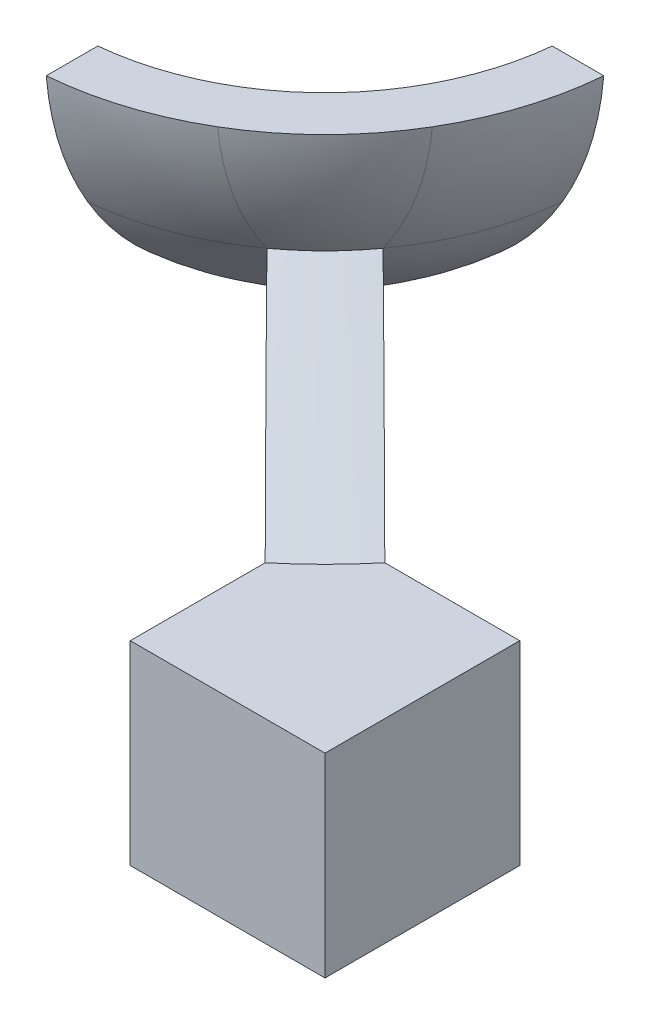
ISO-10303-21;
HEADER;
FILE_DESCRIPTION(('STEP AP214'),'2;1');
FILE_NAME('part.step','',(''),(''),'','','');
FILE_SCHEMA(('AUTOMOTIVE_DESIGN { 1 0 10303 214 1 1 1 1 }'));
ENDSEC;
DATA;
#1=APPLICATION_CONTEXT('core data for automotive mechanical design processes');
#2=APPLICATION_PROTOCOL_DEFINITION('international standard','automotive_design',2000,#1);
#3=PRODUCT_CONTEXT('',#1,'mechanical');
#4=PRODUCT('Part','Part','',(#3));
#5=PRODUCT_RELATED_PRODUCT_CATEGORY('part','',(#4));
#6=PRODUCT_DEFINITION_FORMATION('','',#4);
#7=PRODUCT_DEFINITION_CONTEXT('part definition',#1,'design');
#8=PRODUCT_DEFINITION('design','',#6,#7);
#9=PRODUCT_DEFINITION_SHAPE('','',#8);
#10=(LENGTH_UNIT() NAMED_UNIT(*) SI_UNIT(.MILLI.,.METRE.));
#11=(NAMED_UNIT(*) PLANE_ANGLE_UNIT() SI_UNIT($,.RADIAN.));
#12=(NAMED_UNIT(*) SI_UNIT($,.STERADIAN.) SOLID_ANGLE_UNIT());
#13=UNCERTAINTY_MEASURE_WITH_UNIT(LENGTH_MEASURE(1.E-05),#10,'distance_accuracy_value','');
#14=(GEOMETRIC_REPRESENTATION_CONTEXT(3) GLOBAL_UNCERTAINTY_ASSIGNED_CONTEXT((#13)) GLOBAL_UNIT_ASSIGNED_CONTEXT((#10,
#11,#12)) REPRESENTATION_CONTEXT('',''));
#15=CARTESIAN_POINT('',(0.,0.,0.));
#16=DIRECTION('',(0.,0.,1.));
#17=DIRECTION('',(1.,0.,0.));
#18=AXIS2_PLACEMENT_3D('',#15,#16,#17);
#19=CARTESIAN_POINT('',(20.4238486312594,0.,1.70874488464023));
#20=DIRECTION('',(0.,0.,1.));
#21=DIRECTION('',(-1.,0.,0.));
#22=AXIS2_PLACEMENT_3D('',#19,#20,#21);
#23=PLANE('',#22);
#24=CARTESIAN_POINT('',(0.,0.,1.7087448846402));
#25=DIRECTION('',(0.,0.,1.));
#26=DIRECTION('',(-1.,0.,0.));
#27=AXIS2_PLACEMENT_3D('',#24,#25,#26);
#28=CIRCLE('',#27,20.4238486312594);
#29=CARTESIAN_POINT('',(10.3965301491596,-17.5796972035986,1.70874488464014));
#30=VERTEX_POINT('',#29);
#31=CARTESIAN_POINT('',(17.5796972035986,-10.3965301491595,1.70874488464016));
#32=VERTEX_POINT('',#31);
#33=EDGE_CURVE('E216',#30,#32,#28,.T.);
#34=ORIENTED_EDGE('',*,*,#33,.F.);
#35=CARTESIAN_POINT('',(1.70874488464028,-20.352242722408,1.70874488464013));
#36=VERTEX_POINT('',#35);
#37=EDGE_CURVE('E221',#36,#30,#28,.T.);
#38=ORIENTED_EDGE('',*,*,#37,.F.);
#39=DIRECTION('',(0.,1.,0.));
#40=VECTOR('',#39,1.);
#41=CARTESIAN_POINT('',(1.70874488464021,0.,1.70874488464025));
#42=LINE('',#41,#40);
#43=CARTESIAN_POINT('',(1.70874488464027,-16.9058781989141,1.70874488464011));
#44=VERTEX_POINT('',#43);
#45=EDGE_CURVE('E175',#36,#44,#42,.T.);
#46=ORIENTED_EDGE('',*,*,#45,.T.);
#47=CARTESIAN_POINT('',(0.,0.,1.70874488464017));
#48=DIRECTION('',(0.,0.,1.));
#49=DIRECTION('',(-1.,0.,0.));
#50=AXIS2_PLACEMENT_3D('',#47,#48,#49);
#51=CIRCLE('',#50,16.9920136169114);
#52=CARTESIAN_POINT('',(9.85982311940891,-13.8388010611929,1.70874488464012));
#53=VERTEX_POINT('',#52);
#54=EDGE_CURVE('E214',#44,#53,#51,.T.);
#55=ORIENTED_EDGE('',*,*,#54,.T.);
#56=CARTESIAN_POINT('',(13.8388010611929,-9.85982311940887,1.70874488464019));
#57=VERTEX_POINT('',#56);
#58=EDGE_CURVE('E211',#53,#57,#51,.T.);
#59=ORIENTED_EDGE('',*,*,#58,.T.);
#60=CARTESIAN_POINT('',(0.,0.,1.70874488464021));
#61=DIRECTION('',(0.,0.,1.));
#62=DIRECTION('',(0.,-1.,0.));
#63=AXIS2_PLACEMENT_3D('',#60,#61,#62);
#64=CIRCLE('',#63,16.9920136169114);
#65=CARTESIAN_POINT('',(16.9058781989141,-1.70874488464017,1.70874488464017));
#66=VERTEX_POINT('',#65);
#67=EDGE_CURVE('E225',#57,#66,#64,.T.);
#68=ORIENTED_EDGE('',*,*,#67,.T.);
#69=DIRECTION('',(-1.,0.,0.));
#70=VECTOR('',#69,1.);
#71=CARTESIAN_POINT('',(20.4238486312594,-1.70874488464022,1.70874488464022));
#72=LINE('',#71,#70);
#73=CARTESIAN_POINT('',(20.352242722408,-1.7087448846402,1.70874488464022));
#74=VERTEX_POINT('',#73);
#75=EDGE_CURVE('E227',#74,#66,#72,.T.);
#76=ORIENTED_EDGE('',*,*,#75,.F.);
#77=EDGE_CURVE('E224',#32,#74,#28,.T.);
#78=ORIENTED_EDGE('',*,*,#77,.F.);
#79=EDGE_LOOP('',(#34,#38,#46,#55,#59,#68,#76,#78));
#80=FACE_BOUND('',#79,.T.);
#81=ADVANCED_FACE('F39',(#80),#23,.F.);
#82=CARTESIAN_POINT('',(1.70874488464014,20.4238486312594,0.));
#83=DIRECTION('',(1.,0.,0.));
#84=DIRECTION('',(0.,-1.,0.));
#85=AXIS2_PLACEMENT_3D('',#82,#83,#84);
#86=PLANE('',#85);
#87=CARTESIAN_POINT('',(1.70874488464022,0.,0.));
#88=DIRECTION('',(1.,0.,0.));
#89=DIRECTION('',(0.,1.,0.));
#90=AXIS2_PLACEMENT_3D('',#87,#88,#89);
#91=CIRCLE('',#90,16.9920136169114);
#92=CARTESIAN_POINT('',(1.70874488464026,-13.8388010611929,9.85982311940882));
#93=VERTEX_POINT('',#92);
#94=CARTESIAN_POINT('',(1.70874488464025,-9.85982311940887,13.8388010611929));
#95=VERTEX_POINT('',#94);
#96=EDGE_CURVE('E186',#93,#95,#91,.F.);
#97=ORIENTED_EDGE('',*,*,#96,.F.);
#98=EDGE_CURVE('E192',#44,#93,#91,.F.);
#99=ORIENTED_EDGE('',*,*,#98,.F.);
#100=ORIENTED_EDGE('',*,*,#45,.F.);
#101=CARTESIAN_POINT('',(1.70874488464022,0.,0.));
#102=DIRECTION('',(1.,0.,0.));
#103=DIRECTION('',(0.,1.,0.));
#104=AXIS2_PLACEMENT_3D('',#101,#102,#103);
#105=CIRCLE('',#104,20.4238486312594);
#106=CARTESIAN_POINT('',(1.70874488464028,-17.5796972035986,10.3965301491595));
#107=VERTEX_POINT('',#106);
#108=EDGE_CURVE('E170',#36,#107,#105,.F.);
#109=ORIENTED_EDGE('',*,*,#108,.T.);
#110=CARTESIAN_POINT('',(1.70874488464019,0.,0.));
#111=DIRECTION('',(-1.,0.,0.));
#112=DIRECTION('',(0.,-1.,0.));
#113=AXIS2_PLACEMENT_3D('',#110,#111,#112);
#114=CIRCLE('',#113,20.4238486312594);
#115=CARTESIAN_POINT('',(1.70874488464026,-10.3965301491595,17.5796972035986));
#116=VERTEX_POINT('',#115);
#117=EDGE_CURVE('E43',#107,#116,#114,.T.);
#118=ORIENTED_EDGE('',*,*,#117,.T.);
#119=CARTESIAN_POINT('',(1.70874488464022,0.,0.));
#120=DIRECTION('',(1.,0.,0.));
#121=DIRECTION('',(0.,1.,0.));
#122=AXIS2_PLACEMENT_3D('',#119,#120,#121);
#123=CIRCLE('',#122,20.4238486312594);
#124=CARTESIAN_POINT('',(1.7087448846402,-1.7087448846402,20.352242722408));
#125=VERTEX_POINT('',#124);
#126=EDGE_CURVE('E258',#116,#125,#123,.F.);
#127=ORIENTED_EDGE('',*,*,#126,.T.);
#128=DIRECTION('',(0.,0.,1.));
#129=VECTOR('',#128,1.);
#130=CARTESIAN_POINT('',(1.70874488464022,-1.70874488464025,0.));
#131=LINE('',#130,#129);
#132=CARTESIAN_POINT('',(1.70874488464022,-1.70874488464017,16.9058781989141));
#133=VERTEX_POINT('',#132);
#134=EDGE_CURVE('E269',#133,#125,#131,.T.);
#135=ORIENTED_EDGE('',*,*,#134,.F.);
#136=EDGE_CURVE('E193',#95,#133,#91,.F.);
#137=ORIENTED_EDGE('',*,*,#136,.F.);
#138=EDGE_LOOP('',(#97,#99,#100,#109,#118,#127,#135,#137));
#139=FACE_BOUND('',#138,.T.);
#140=ADVANCED_FACE('F172',(#139),#86,.F.);
#141=CARTESIAN_POINT('',(23.8515645548495,-1.70874488464026,0.));
#142=DIRECTION('',(0.,-1.,0.));
#143=DIRECTION('',(-1.,0.,0.));
#144=AXIS2_PLACEMENT_3D('',#141,#142,#143);
#145=PLANE('',#144);
#146=CARTESIAN_POINT('',(0.,-1.7087448846402,0.));
#147=DIRECTION('',(0.,1.,0.));
#148=DIRECTION('',(-1.,0.,0.));
#149=AXIS2_PLACEMENT_3D('',#146,#147,#148);
#150=CIRCLE('',#149,20.4238486312594);
#151=CARTESIAN_POINT('',(10.3965301491595,-1.70874488464026,17.5796972035986));
#152=VERTEX_POINT('',#151);
#153=CARTESIAN_POINT('',(17.5796972035986,-1.7087448846402,10.3965301491595));
#154=VERTEX_POINT('',#153);
#155=EDGE_CURVE('E249',#152,#154,#150,.T.);
#156=ORIENTED_EDGE('',*,*,#155,.T.);
#157=EDGE_CURVE('E268',#154,#74,#150,.T.);
#158=ORIENTED_EDGE('',*,*,#157,.T.);
#159=ORIENTED_EDGE('',*,*,#75,.T.);
#160=CARTESIAN_POINT('',(0.,-1.70874488464017,0.));
#161=DIRECTION('',(0.,1.,0.));
#162=DIRECTION('',(-1.,0.,0.));
#163=AXIS2_PLACEMENT_3D('',#160,#161,#162);
#164=CIRCLE('',#163,16.9920136169114);
#165=CARTESIAN_POINT('',(13.8388010611929,-1.70874488464017,9.85982311940887));
#166=VERTEX_POINT('',#165);
#167=EDGE_CURVE('E228',#166,#66,#164,.T.);
#168=ORIENTED_EDGE('',*,*,#167,.F.);
#169=CARTESIAN_POINT('',(0.,-1.70874488464025,0.));
#170=DIRECTION('',(0.,-1.,0.));
#171=DIRECTION('',(1.,0.,0.));
#172=AXIS2_PLACEMENT_3D('',#169,#170,#171);
#173=CIRCLE('',#172,16.9920136169114);
#174=CARTESIAN_POINT('',(9.85982311940888,-1.70874488464017,13.8388010611929));
#175=VERTEX_POINT('',#174);
#176=EDGE_CURVE('E231',#175,#166,#173,.F.);
#177=ORIENTED_EDGE('',*,*,#176,.F.);
#178=EDGE_CURVE('E230',#133,#175,#164,.T.);
#179=ORIENTED_EDGE('',*,*,#178,.F.);
#180=ORIENTED_EDGE('',*,*,#134,.T.);
#181=CARTESIAN_POINT('',(0.,-1.70874488464026,0.));
#182=DIRECTION('',(0.,-1.,0.));
#183=DIRECTION('',(1.,0.,0.));
#184=AXIS2_PLACEMENT_3D('',#181,#182,#183);
#185=CIRCLE('',#184,20.4238486312594);
#186=EDGE_CURVE('E236',#152,#125,#185,.T.);
#187=ORIENTED_EDGE('',*,*,#186,.F.);
#188=EDGE_LOOP('',(#156,#158,#159,#168,#177,#179,#180,#187));
#189=FACE_BOUND('',#188,.T.);
#190=ADVANCED_FACE('F370',(#189),#145,.F.);
#191=CARTESIAN_POINT('',(32.4999999999998,-19.4739802922102,0.));
#192=DIRECTION('',(0.,1.,0.));
#193=DIRECTION('',(1.,0.,0.));
#194=AXIS2_PLACEMENT_3D('',#191,#192,#193);
#195=PLANE('',#194);
#196=DIRECTION('',(0.,0.,1.));
#197=VECTOR('',#196,1.);
#198=CARTESIAN_POINT('',(32.5,-19.4739802922102,-32.5));
#199=LINE('',#198,#197);
#200=CARTESIAN_POINT('',(32.5,-19.4739802922104,19.4739802922101));
#201=VERTEX_POINT('',#200);
#202=CARTESIAN_POINT('',(32.5,-19.4739802922102,32.5));
#203=VERTEX_POINT('',#202);
#204=EDGE_CURVE('E243',#201,#203,#199,.T.);
#205=ORIENTED_EDGE('',*,*,#204,.F.);
#206=DIRECTION('',(-1.,0.,0.));
#207=VECTOR('',#206,1.);
#208=CARTESIAN_POINT('',(32.4999999999998,-19.4739802922102,19.4739802922101));
#209=LINE('',#208,#207);
#210=CARTESIAN_POINT('',(23.4736893474076,-19.4739802922102,19.4739802922101));
#211=VERTEX_POINT('',#210);
#212=EDGE_CURVE('E287',#201,#211,#209,.T.);
#213=ORIENTED_EDGE('',*,*,#212,.T.);
#214=CARTESIAN_POINT('',(0.,-19.4739802922102,0.));
#215=DIRECTION('',(0.,1.,0.));
#216=DIRECTION('',(-1.,0.,0.));
#217=AXIS2_PLACEMENT_3D('',#214,#215,#216);
#218=CIRCLE('',#217,30.4999999999998);
#219=CARTESIAN_POINT('',(19.4739802922103,-19.4739802922102,23.4736893474075));
#220=VERTEX_POINT('',#219);
#221=EDGE_CURVE('E346',#220,#211,#218,.T.);
#222=ORIENTED_EDGE('',*,*,#221,.F.);
#223=DIRECTION('',(0.,0.,1.));
#224=VECTOR('',#223,1.);
#225=CARTESIAN_POINT('',(19.4739802922103,-19.4739802922102,0.));
#226=LINE('',#225,#224);
#227=CARTESIAN_POINT('',(19.4739802922103,-19.4739802922104,32.5));
#228=VERTEX_POINT('',#227);
#229=EDGE_CURVE('E220',#220,#228,#226,.T.);
#230=ORIENTED_EDGE('',*,*,#229,.T.);
#231=DIRECTION('',(1.,0.,0.));
#232=VECTOR('',#231,1.);
#233=CARTESIAN_POINT('',(0.,-19.4739802922102,32.5));
#234=LINE('',#233,#232);
#235=EDGE_CURVE('E245',#228,#203,#234,.T.);
#236=ORIENTED_EDGE('',*,*,#235,.T.);
#237=EDGE_LOOP('',(#205,#213,#222,#230,#236));
#238=FACE_BOUND('',#237,.T.);
#239=ADVANCED_FACE('F372',(#238),#195,.T.);
#240=CARTESIAN_POINT('',(32.4999999999998,0.,19.4739802922102));
#241=DIRECTION('',(0.,0.,-1.));
#242=DIRECTION('',(1.,0.,0.));
#243=AXIS2_PLACEMENT_3D('',#240,#241,#242);
#244=PLANE('',#243);
#245=DIRECTION('',(0.,1.,0.));
#246=VECTOR('',#245,1.);
#247=CARTESIAN_POINT('',(32.5,-32.5000000000002,19.4739802922101));
#248=LINE('',#247,#246);
#249=CARTESIAN_POINT('',(32.5,-32.5,19.4739802922101));
#250=VERTEX_POINT('',#249);
#251=EDGE_CURVE('E76',#250,#201,#248,.T.);
#252=ORIENTED_EDGE('',*,*,#251,.F.);
#253=DIRECTION('',(1.,0.,0.));
#254=VECTOR('',#253,1.);
#255=CARTESIAN_POINT('',(-32.5,-32.5,19.4739802922101));
#256=LINE('',#255,#254);
#257=CARTESIAN_POINT('',(19.4739802922103,-32.5,19.4739802922101));
#258=VERTEX_POINT('',#257);
#259=EDGE_CURVE('E69',#258,#250,#256,.T.);
#260=ORIENTED_EDGE('',*,*,#259,.F.);
#261=DIRECTION('',(0.,1.,0.));
#262=VECTOR('',#261,1.);
#263=CARTESIAN_POINT('',(19.4739802922102,-1.11022302462516E-13,19.4739802922102));
#264=LINE('',#263,#262);
#265=CARTESIAN_POINT('',(19.4739802922103,-23.4736893474076,19.4739802922101));
#266=VERTEX_POINT('',#265);
#267=EDGE_CURVE('E325',#258,#266,#264,.T.);
#268=ORIENTED_EDGE('',*,*,#267,.T.);
#269=CARTESIAN_POINT('',(0.,0.,19.4739802922102));
#270=DIRECTION('',(0.,0.,1.));
#271=DIRECTION('',(-1.,0.,0.));
#272=AXIS2_PLACEMENT_3D('',#269,#270,#271);
#273=CIRCLE('',#272,30.4999999999998);
#274=EDGE_CURVE('E187',#266,#211,#273,.T.);
#275=ORIENTED_EDGE('',*,*,#274,.T.);
#276=ORIENTED_EDGE('',*,*,#212,.F.);
#277=EDGE_LOOP('',(#252,#260,#268,#275,#276));
#278=FACE_BOUND('',#277,.T.);
#279=ADVANCED_FACE('F378',(#278),#244,.T.);
#280=CARTESIAN_POINT('',(0.,-19.4739802922102,0.));
#281=DIRECTION('',(0.,-1.,0.));
#282=DIRECTION('',(-1.,0.,0.));
#283=AXIS2_PLACEMENT_3D('',#280,#281,#282);
#284=CONICAL_SURFACE('',#283,30.4999999999998,0.955316618124508);
#285=ORIENTED_EDGE('',*,*,#221,.T.);
#286=CARTESIAN_POINT('',(23.4738909308181,-19.4741802922102,19.4741802922101));
#287=CARTESIAN_POINT('',(22.7101001064626,-18.7164266419262,18.7164266419261));
#288=CARTESIAN_POINT('',(21.9459701488568,-17.9588435691827,17.9588435691826));
#289=CARTESIAN_POINT('',(20.4166491520076,-16.444215663745,16.4442156637449));
#290=CARTESIAN_POINT('',(19.6514581150735,-15.6871708298847,15.6871708298847));
#291=CARTESIAN_POINT('',(18.1196276592264,-14.1738120372715,14.1738120372714));
#292=CARTESIAN_POINT('',(17.3529882381043,-13.4174980796359,13.4174980796358));
#293=CARTESIAN_POINT('',(16.2014221397684,-12.2838419721871,12.283841972187));
#294=CARTESIAN_POINT('',(15.8172985280987,-11.9060919983213,11.9060919983212));
#295=CARTESIAN_POINT('',(15.0483761703602,-11.1509354971935,11.1509354971935));
#296=CARTESIAN_POINT('',(14.6635774239313,-10.7735289701148,10.7735289701148));
#297=CARTESIAN_POINT('',(14.278371437784,-10.3963301491595,10.3963301491595));
#298=B_SPLINE_CURVE_WITH_KNOTS('',3,(#286,#287,#288,#289,#290,#291,#292,#293,#294,#295,#296,
#297),.UNSPECIFIED.,.F.,.F.,(4,2,2,2,2,4),(0.,3.9478883475227,7.89576811623766,11.8436539110033,
13.8176010932539,15.7915493284936),.UNSPECIFIED.);
#299=CARTESIAN_POINT('',(14.278575689074,-10.3965301491595,10.3965301491595));
#300=VERTEX_POINT('',#299);
#301=EDGE_CURVE('E290',#211,#300,#298,.T.);
#302=ORIENTED_EDGE('',*,*,#301,.T.);
#303=CARTESIAN_POINT('',(0.,-10.3965301491595,0.));
#304=DIRECTION('',(0.,1.,0.));
#305=DIRECTION('',(-1.,0.,0.));
#306=AXIS2_PLACEMENT_3D('',#303,#304,#305);
#307=CIRCLE('',#306,17.662546895932);
#308=CARTESIAN_POINT('',(10.3965301491596,-10.3965301491595,14.2785756890739));
#309=VERTEX_POINT('',#308);
#310=EDGE_CURVE('E358',#309,#300,#307,.T.);
#311=ORIENTED_EDGE('',*,*,#310,.F.);
#312=CARTESIAN_POINT('',(10.3963301491596,-10.3963301491595,14.278371437784));
#313=CARTESIAN_POINT('',(10.7735289701149,-10.7735289701148,14.6635774239313));
#314=CARTESIAN_POINT('',(11.1509354971936,-11.1509354971935,15.0483761703602));
#315=CARTESIAN_POINT('',(11.9060919983213,-11.9060919983213,15.8172985280987));
#316=CARTESIAN_POINT('',(12.2838419721871,-12.2838419721871,16.2014221397683));
#317=CARTESIAN_POINT('',(13.4174980796359,-13.4174980796359,17.3529882381043));
#318=CARTESIAN_POINT('',(14.1738120372715,-14.1738120372715,18.1196276592263));
#319=CARTESIAN_POINT('',(15.6871708298848,-15.6871708298847,19.6514581150734));
#320=CARTESIAN_POINT('',(16.4442156637451,-16.444215663745,20.4166491520075));
#321=CARTESIAN_POINT('',(17.9588435691828,-17.9588435691827,21.9459701488567));
#322=CARTESIAN_POINT('',(18.7164266419262,-18.7164266419262,22.7101001064626));
#323=CARTESIAN_POINT('',(19.4741802922103,-19.4741802922102,23.473890930818));
#324=B_SPLINE_CURVE_WITH_KNOTS('',3,(#312,#313,#314,#315,#316,#317,#318,#319,#320,#321,#322,
#323),.UNSPECIFIED.,.F.,.F.,(4,2,2,2,2,4),(0.,1.97394823523975,3.94789541749027,
7.89578121225594,11.8436609809709,15.7915493284936),.UNSPECIFIED.);
#325=EDGE_CURVE('E254',#309,#220,#324,.T.);
#326=ORIENTED_EDGE('',*,*,#325,.T.);
#327=EDGE_LOOP('',(#285,#302,#311,#326));
#328=FACE_BOUND('',#327,.T.);
#329=ADVANCED_FACE('F304',(#328),#284,.T.);
#330=CARTESIAN_POINT('',(19.4739802922101,32.4999999999999,0.));
#331=DIRECTION('',(-1.,0.,0.));
#332=DIRECTION('',(0.,1.,0.));
#333=AXIS2_PLACEMENT_3D('',#330,#331,#332);
#334=PLANE('',#333);
#335=DIRECTION('',(0.,0.,-1.));
#336=VECTOR('',#335,1.);
#337=CARTESIAN_POINT('',(19.4739802922103,-32.5,-32.5));
#338=LINE('',#337,#336);
#339=CARTESIAN_POINT('',(19.4739802922103,-32.5,32.5));
#340=VERTEX_POINT('',#339);
#341=EDGE_CURVE('E262',#340,#258,#338,.T.);
#342=ORIENTED_EDGE('',*,*,#341,.F.);
#343=DIRECTION('',(0.,1.,0.));
#344=VECTOR('',#343,1.);
#345=CARTESIAN_POINT('',(19.4739802922102,0.,32.5));
#346=LINE('',#345,#344);
#347=EDGE_CURVE('E248',#340,#228,#346,.T.);
#348=ORIENTED_EDGE('',*,*,#347,.T.);
#349=ORIENTED_EDGE('',*,*,#229,.F.);
#350=CARTESIAN_POINT('',(19.4739802922102,0.,0.));
#351=DIRECTION('',(-1.,0.,0.));
#352=DIRECTION('',(0.,-1.,0.));
#353=AXIS2_PLACEMENT_3D('',#350,#351,#352);
#354=CIRCLE('',#353,30.4999999999998);
#355=EDGE_CURVE('E49',#266,#220,#354,.T.);
#356=ORIENTED_EDGE('',*,*,#355,.F.);
#357=ORIENTED_EDGE('',*,*,#267,.F.);
#358=EDGE_LOOP('',(#342,#348,#349,#356,#357));
#359=FACE_BOUND('',#358,.T.);
#360=ADVANCED_FACE('F381',(#359),#334,.T.);
#361=CARTESIAN_POINT('',(19.4739802922102,0.,0.));
#362=DIRECTION('',(1.,0.,0.));
#363=DIRECTION('',(0.,-1.,0.));
#364=AXIS2_PLACEMENT_3D('',#361,#362,#363);
#365=CONICAL_SURFACE('',#364,30.4999999999998,0.955316618124508);
#366=ORIENTED_EDGE('',*,*,#325,.F.);
#367=CARTESIAN_POINT('',(10.3965301491595,0.,0.));
#368=DIRECTION('',(-1.,0.,0.));
#369=DIRECTION('',(0.,-1.,0.));
#370=AXIS2_PLACEMENT_3D('',#367,#368,#369);
#371=CIRCLE('',#370,17.662546895932);
#372=CARTESIAN_POINT('',(10.3965301491596,-14.2785756890739,10.3965301491595));
#373=VERTEX_POINT('',#372);
#374=EDGE_CURVE('E11',#373,#309,#371,.T.);
#375=ORIENTED_EDGE('',*,*,#374,.F.);
#376=CARTESIAN_POINT('',(19.4741802922103,-23.473890930818,19.4741802922101));
#377=CARTESIAN_POINT('',(18.7164266419262,-22.7101001064626,18.7164266419261));
#378=CARTESIAN_POINT('',(17.9588435691828,-21.9459701488568,17.9588435691827));
#379=CARTESIAN_POINT('',(16.4442156637451,-20.4166491520076,16.4442156637449));
#380=CARTESIAN_POINT('',(15.6871708298848,-19.6514581150735,15.6871708298847));
#381=CARTESIAN_POINT('',(14.1738120372715,-18.1196276592264,14.1738120372714));
#382=CARTESIAN_POINT('',(13.4174980796359,-17.3529882381043,13.4174980796358));
#383=CARTESIAN_POINT('',(12.2838419721871,-16.2014221397684,12.283841972187));
#384=CARTESIAN_POINT('',(11.9060919983213,-15.8172985280987,11.9060919983212));
#385=CARTESIAN_POINT('',(11.1509354971936,-15.0483761703602,11.1509354971935));
#386=CARTESIAN_POINT('',(10.7735289701149,-14.6635774239313,10.7735289701148));
#387=CARTESIAN_POINT('',(10.3963301491596,-14.278371437784,10.3963301491595));
#388=B_SPLINE_CURVE_WITH_KNOTS('',3,(#376,#377,#378,#379,#380,#381,#382,#383,#384,#385,#386,
#387),.UNSPECIFIED.,.F.,.F.,(4,2,2,2,2,4),(0.,3.9478883475227,7.89576811623767,11.8436539110034,
13.8176010932539,15.7915493284936),.UNSPECIFIED.);
#389=EDGE_CURVE('E260',#266,#373,#388,.T.);
#390=ORIENTED_EDGE('',*,*,#389,.F.);
#391=ORIENTED_EDGE('',*,*,#355,.T.);
#392=EDGE_LOOP('',(#366,#375,#390,#391));
#393=FACE_BOUND('',#392,.T.);
#394=ADVANCED_FACE('F313',(#393),#365,.T.);
#395=CARTESIAN_POINT('',(0.,0.,19.4739802922102));
#396=DIRECTION('',(0.,0.,1.));
#397=DIRECTION('',(-1.,0.,0.));
#398=AXIS2_PLACEMENT_3D('',#395,#396,#397);
#399=CONICAL_SURFACE('',#398,30.4999999999998,0.955316618124508);
#400=ORIENTED_EDGE('',*,*,#301,.F.);
#401=ORIENTED_EDGE('',*,*,#274,.F.);
#402=ORIENTED_EDGE('',*,*,#389,.T.);
#403=CARTESIAN_POINT('',(0.,0.,10.3965301491595));
#404=DIRECTION('',(0.,0.,1.));
#405=DIRECTION('',(-1.,0.,0.));
#406=AXIS2_PLACEMENT_3D('',#403,#404,#405);
#407=CIRCLE('',#406,17.662546895932);
#408=EDGE_CURVE('E182',#373,#300,#407,.T.);
#409=ORIENTED_EDGE('',*,*,#408,.T.);
#410=EDGE_LOOP('',(#400,#401,#402,#409));
#411=FACE_BOUND('',#410,.T.);
#412=ADVANCED_FACE('F308',(#411),#399,.T.);
#413=CARTESIAN_POINT('',(0.,0.,0.));
#414=DIRECTION('',(0.,0.,1.));
#415=DIRECTION('',(1.,0.,0.));
#416=AXIS2_PLACEMENT_3D('',#413,#414,#415);
#417=SPHERICAL_SURFACE('',#416,17.0777145964584);
#418=ORIENTED_EDGE('',*,*,#54,.F.);
#419=ORIENTED_EDGE('',*,*,#98,.T.);
#420=CARTESIAN_POINT('',(0.,0.,9.85982311940886));
#421=DIRECTION('',(0.,0.,1.));
#422=DIRECTION('',(-1.,0.,0.));
#423=AXIS2_PLACEMENT_3D('',#420,#421,#422);
#424=CIRCLE('',#423,13.9438955780678);
#425=CARTESIAN_POINT('',(9.8598231194089,-9.85982311940887,9.85982311940876));
#426=VERTEX_POINT('',#425);
#427=EDGE_CURVE('E194',#93,#426,#424,.T.);
#428=ORIENTED_EDGE('',*,*,#427,.T.);
#429=CARTESIAN_POINT('',(9.85982311940887,0.,0.));
#430=DIRECTION('',(-1.,0.,0.));
#431=DIRECTION('',(0.,-1.,0.));
#432=AXIS2_PLACEMENT_3D('',#429,#430,#431);
#433=CIRCLE('',#432,13.9438955780678);
#434=EDGE_CURVE('E327',#53,#426,#433,.T.);
#435=ORIENTED_EDGE('',*,*,#434,.F.);
#436=EDGE_LOOP('',(#418,#419,#428,#435));
#437=FACE_BOUND('',#436,.T.);
#438=ADVANCED_FACE('F312',(#437),#417,.F.);
#439=CARTESIAN_POINT('',(0.,0.,0.));
#440=DIRECTION('',(1.,0.,0.));
#441=DIRECTION('',(0.,1.,0.));
#442=AXIS2_PLACEMENT_3D('',#439,#440,#441);
#443=SPHERICAL_SURFACE('',#442,17.0777145964584);
#444=ORIENTED_EDGE('',*,*,#96,.T.);
#445=CARTESIAN_POINT('',(0.,-9.85982311940886,0.));
#446=DIRECTION('',(0.,1.,0.));
#447=DIRECTION('',(-1.,0.,0.));
#448=AXIS2_PLACEMENT_3D('',#445,#446,#447);
#449=CIRCLE('',#448,13.9438955780678);
#450=EDGE_CURVE('E331',#95,#426,#449,.T.);
#451=ORIENTED_EDGE('',*,*,#450,.T.);
#452=ORIENTED_EDGE('',*,*,#427,.F.);
#453=EDGE_LOOP('',(#444,#451,#452));
#454=FACE_BOUND('',#453,.T.);
#455=ADVANCED_FACE('F337',(#454),#443,.F.);
#456=ORIENTED_EDGE('',*,*,#434,.T.);
#457=EDGE_CURVE('E213',#426,#57,#449,.T.);
#458=ORIENTED_EDGE('',*,*,#457,.T.);
#459=ORIENTED_EDGE('',*,*,#58,.F.);
#460=EDGE_LOOP('',(#456,#458,#459));
#461=FACE_BOUND('',#460,.T.);
#462=ADVANCED_FACE('F343',(#461),#417,.F.);
#463=CARTESIAN_POINT('',(0.,0.,0.));
#464=DIRECTION('',(0.,-1.,0.));
#465=DIRECTION('',(1.,0.,0.));
#466=AXIS2_PLACEMENT_3D('',#463,#464,#465);
#467=SPHERICAL_SURFACE('',#466,17.0777145964584);
#468=ORIENTED_EDGE('',*,*,#450,.F.);
#469=ORIENTED_EDGE('',*,*,#136,.T.);
#470=ORIENTED_EDGE('',*,*,#178,.T.);
#471=CARTESIAN_POINT('',(9.85982311940887,0.,0.));
#472=DIRECTION('',(-1.,0.,0.));
#473=DIRECTION('',(0.,-1.,0.));
#474=AXIS2_PLACEMENT_3D('',#471,#472,#473);
#475=CIRCLE('',#474,13.9438955780678);
#476=EDGE_CURVE('E217',#426,#175,#475,.T.);
#477=ORIENTED_EDGE('',*,*,#476,.F.);
#478=EDGE_LOOP('',(#468,#469,#470,#477));
#479=FACE_BOUND('',#478,.T.);
#480=ADVANCED_FACE('F316',(#479),#467,.F.);
#481=ORIENTED_EDGE('',*,*,#176,.T.);
#482=CARTESIAN_POINT('',(0.,0.,9.85982311940887));
#483=DIRECTION('',(0.,0.,-1.));
#484=DIRECTION('',(0.,1.,0.));
#485=AXIS2_PLACEMENT_3D('',#482,#483,#484);
#486=CIRCLE('',#485,13.9438955780678);
#487=EDGE_CURVE('E203',#166,#426,#486,.T.);
#488=ORIENTED_EDGE('',*,*,#487,.T.);
#489=ORIENTED_EDGE('',*,*,#476,.T.);
#490=EDGE_LOOP('',(#481,#488,#489));
#491=FACE_BOUND('',#490,.T.);
#492=ADVANCED_FACE('F420',(#491),#467,.F.);
#493=ORIENTED_EDGE('',*,*,#67,.F.);
#494=ORIENTED_EDGE('',*,*,#457,.F.);
#495=ORIENTED_EDGE('',*,*,#487,.F.);
#496=ORIENTED_EDGE('',*,*,#167,.T.);
#497=EDGE_LOOP('',(#493,#494,#495,#496));
#498=FACE_BOUND('',#497,.T.);
#499=ADVANCED_FACE('F340',(#498),#467,.F.);
#500=CARTESIAN_POINT('',(0.,0.,0.));
#501=DIRECTION('',(0.,-1.,0.));
#502=DIRECTION('',(1.,0.,0.));
#503=AXIS2_PLACEMENT_3D('',#500,#501,#502);
#504=SPHERICAL_SURFACE('',#503,20.4952043657383);
#505=ORIENTED_EDGE('',*,*,#310,.T.);
#506=CARTESIAN_POINT('',(0.,0.,10.3965301491595));
#507=DIRECTION('',(0.,0.,-1.));
#508=DIRECTION('',(0.,1.,0.));
#509=AXIS2_PLACEMENT_3D('',#506,#507,#508);
#510=CIRCLE('',#509,17.662546895932);
#511=EDGE_CURVE('E251',#300,#154,#510,.F.);
#512=ORIENTED_EDGE('',*,*,#511,.T.);
#513=ORIENTED_EDGE('',*,*,#155,.F.);
#514=CARTESIAN_POINT('',(10.3965301491595,0.,0.));
#515=DIRECTION('',(-1.,0.,0.));
#516=DIRECTION('',(0.,-1.,0.));
#517=AXIS2_PLACEMENT_3D('',#514,#515,#516);
#518=CIRCLE('',#517,17.662546895932);
#519=EDGE_CURVE('E255',#152,#309,#518,.F.);
#520=ORIENTED_EDGE('',*,*,#519,.T.);
#521=EDGE_LOOP('',(#505,#512,#513,#520));
#522=FACE_BOUND('',#521,.T.);
#523=ADVANCED_FACE('F369',(#522),#504,.T.);
#524=ORIENTED_EDGE('',*,*,#519,.F.);
#525=ORIENTED_EDGE('',*,*,#186,.T.);
#526=ORIENTED_EDGE('',*,*,#126,.F.);
#527=EDGE_CURVE('E166',#116,#309,#307,.T.);
#528=ORIENTED_EDGE('',*,*,#527,.T.);
#529=EDGE_LOOP('',(#524,#525,#526,#528));
#530=FACE_BOUND('',#529,.T.);
#531=ADVANCED_FACE('F362',(#530),#504,.T.);
#532=EDGE_CURVE('E223',#300,#32,#307,.T.);
#533=ORIENTED_EDGE('',*,*,#532,.T.);
#534=ORIENTED_EDGE('',*,*,#77,.T.);
#535=ORIENTED_EDGE('',*,*,#157,.F.);
#536=ORIENTED_EDGE('',*,*,#511,.F.);
#537=EDGE_LOOP('',(#533,#534,#535,#536));
#538=FACE_BOUND('',#537,.T.);
#539=ADVANCED_FACE('F314',(#538),#504,.T.);
#540=CARTESIAN_POINT('',(0.,0.,0.));
#541=DIRECTION('',(0.,0.,1.));
#542=DIRECTION('',(1.,0.,0.));
#543=AXIS2_PLACEMENT_3D('',#540,#541,#542);
#544=SPHERICAL_SURFACE('',#543,20.4952043657383);
#545=ORIENTED_EDGE('',*,*,#532,.F.);
#546=ORIENTED_EDGE('',*,*,#408,.F.);
#547=CARTESIAN_POINT('',(10.3965301491595,0.,0.));
#548=DIRECTION('',(-1.,0.,0.));
#549=DIRECTION('',(0.,-1.,0.));
#550=AXIS2_PLACEMENT_3D('',#547,#548,#549);
#551=CIRCLE('',#550,17.662546895932);
#552=EDGE_CURVE('E177',#373,#30,#551,.F.);
#553=ORIENTED_EDGE('',*,*,#552,.T.);
#554=ORIENTED_EDGE('',*,*,#33,.T.);
#555=EDGE_LOOP('',(#545,#546,#553,#554));
#556=FACE_BOUND('',#555,.T.);
#557=ADVANCED_FACE('F354',(#556),#544,.T.);
#558=ORIENTED_EDGE('',*,*,#552,.F.);
#559=EDGE_CURVE('E163',#107,#373,#407,.T.);
#560=ORIENTED_EDGE('',*,*,#559,.F.);
#561=ORIENTED_EDGE('',*,*,#108,.F.);
#562=ORIENTED_EDGE('',*,*,#37,.T.);
#563=EDGE_LOOP('',(#558,#560,#561,#562));
#564=FACE_BOUND('',#563,.T.);
#565=ADVANCED_FACE('F179',(#564),#544,.T.);
#566=CARTESIAN_POINT('',(0.,0.,0.));
#567=DIRECTION('',(1.,0.,0.));
#568=DIRECTION('',(0.,1.,0.));
#569=AXIS2_PLACEMENT_3D('',#566,#567,#568);
#570=SPHERICAL_SURFACE('',#569,20.4952043657383);
#571=ORIENTED_EDGE('',*,*,#527,.F.);
#572=ORIENTED_EDGE('',*,*,#117,.F.);
#573=ORIENTED_EDGE('',*,*,#559,.T.);
#574=ORIENTED_EDGE('',*,*,#374,.T.);
#575=EDGE_LOOP('',(#571,#572,#573,#574));
#576=FACE_BOUND('',#575,.T.);
#577=ADVANCED_FACE('F161',(#576),#570,.T.);
#578=CARTESIAN_POINT('',(32.5,-32.5,-32.5));
#579=DIRECTION('',(1.,0.,0.));
#580=DIRECTION('',(0.,0.,-1.));
#581=AXIS2_PLACEMENT_3D('',#578,#579,#580);
#582=PLANE('',#581);
#583=DIRECTION('',(0.,0.,1.));
#584=VECTOR('',#583,1.);
#585=CARTESIAN_POINT('',(32.5,-32.5,-32.5));
#586=LINE('',#585,#584);
#587=CARTESIAN_POINT('',(32.5,-32.5,32.5));
#588=VERTEX_POINT('',#587);
#589=EDGE_CURVE('E210',#250,#588,#586,.T.);
#590=ORIENTED_EDGE('',*,*,#589,.F.);
#591=ORIENTED_EDGE('',*,*,#251,.T.);
#592=ORIENTED_EDGE('',*,*,#204,.T.);
#593=DIRECTION('',(0.,1.,0.));
#594=VECTOR('',#593,1.);
#595=CARTESIAN_POINT('',(32.5,-32.5,32.5));
#596=LINE('',#595,#594);
#597=EDGE_CURVE('E209',#588,#203,#596,.T.);
#598=ORIENTED_EDGE('',*,*,#597,.F.);
#599=EDGE_LOOP('',(#590,#591,#592,#598));
#600=FACE_BOUND('',#599,.T.);
#601=ADVANCED_FACE('F400',(#600),#582,.T.);
#602=CARTESIAN_POINT('',(-32.5,-32.5,-32.5));
#603=DIRECTION('',(0.,-1.,0.));
#604=DIRECTION('',(0.,0.,-1.));
#605=AXIS2_PLACEMENT_3D('',#602,#603,#604);
#606=PLANE('',#605);
#607=ORIENTED_EDGE('',*,*,#341,.T.);
#608=ORIENTED_EDGE('',*,*,#259,.T.);
#609=ORIENTED_EDGE('',*,*,#589,.T.);
#610=DIRECTION('',(1.,0.,0.));
#611=VECTOR('',#610,1.);
#612=CARTESIAN_POINT('',(-32.5,-32.5,32.5));
#613=LINE('',#612,#611);
#614=EDGE_CURVE('E206',#340,#588,#613,.T.);
#615=ORIENTED_EDGE('',*,*,#614,.F.);
#616=EDGE_LOOP('',(#607,#608,#609,#615));
#617=FACE_BOUND('',#616,.T.);
#618=ADVANCED_FACE('F41',(#617),#606,.T.);
#619=CARTESIAN_POINT('',(0.,0.,32.5));
#620=DIRECTION('',(0.,0.,-1.));
#621=DIRECTION('',(-1.,0.,0.));
#622=AXIS2_PLACEMENT_3D('',#619,#620,#621);
#623=PLANE('',#622);
#624=ORIENTED_EDGE('',*,*,#347,.F.);
#625=ORIENTED_EDGE('',*,*,#614,.T.);
#626=ORIENTED_EDGE('',*,*,#597,.T.);
#627=ORIENTED_EDGE('',*,*,#235,.F.);
#628=EDGE_LOOP('',(#624,#625,#626,#627));
#629=FACE_BOUND('',#628,.T.);
#630=ADVANCED_FACE('F390',(#629),#623,.F.);
#631=CLOSED_SHELL('',(#81,#140,#190,#239,#279,#329,#360,#394,#412,#438,#455,#462,#480,#492,#499,
#523,#531,#539,#557,#565,#577,#601,#618,#630));
#632=MANIFOLD_SOLID_BREP('B2',#631);
#633=ADVANCED_BREP_SHAPE_REPRESENTATION('',(#18,#632),#14);
#634=SHAPE_DEFINITION_REPRESENTATION(#9,#633);
ENDSEC;
END-ISO-10303-21;
